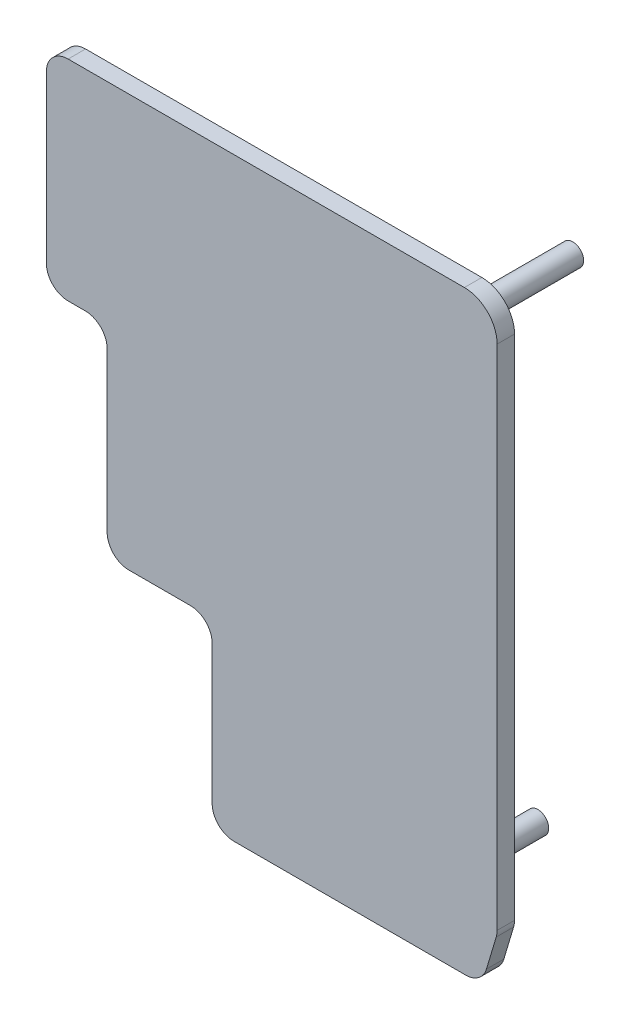
ISO-10303-21;
HEADER;
FILE_DESCRIPTION(('STEP AP214'),'2;1');
FILE_NAME('part.step','',(''),(''),'','','');
FILE_SCHEMA(('AUTOMOTIVE_DESIGN { 1 0 10303 214 1 1 1 1 }'));
ENDSEC;
DATA;
#1=APPLICATION_CONTEXT('core data for automotive mechanical design processes');
#2=APPLICATION_PROTOCOL_DEFINITION('international standard','automotive_design',2000,#1);
#3=PRODUCT_CONTEXT('',#1,'mechanical');
#4=PRODUCT('Part','Part','',(#3));
#5=PRODUCT_RELATED_PRODUCT_CATEGORY('part','',(#4));
#6=PRODUCT_DEFINITION_FORMATION('','',#4);
#7=PRODUCT_DEFINITION_CONTEXT('part definition',#1,'design');
#8=PRODUCT_DEFINITION('design','',#6,#7);
#9=PRODUCT_DEFINITION_SHAPE('','',#8);
#10=(LENGTH_UNIT() NAMED_UNIT(*) SI_UNIT(.MILLI.,.METRE.));
#11=(NAMED_UNIT(*) PLANE_ANGLE_UNIT() SI_UNIT($,.RADIAN.));
#12=(NAMED_UNIT(*) SI_UNIT($,.STERADIAN.) SOLID_ANGLE_UNIT());
#13=UNCERTAINTY_MEASURE_WITH_UNIT(LENGTH_MEASURE(1.E-05),#10,'distance_accuracy_value','');
#14=(GEOMETRIC_REPRESENTATION_CONTEXT(3) GLOBAL_UNCERTAINTY_ASSIGNED_CONTEXT((#13)) GLOBAL_UNIT_ASSIGNED_CONTEXT((#10,
#11,#12)) REPRESENTATION_CONTEXT('',''));
#15=CARTESIAN_POINT('',(0.,0.,0.));
#16=DIRECTION('',(0.,0.,1.));
#17=DIRECTION('',(1.,0.,0.));
#18=AXIS2_PLACEMENT_3D('',#15,#16,#17);
#19=CARTESIAN_POINT('',(68.6324839489616,0.,1.6));
#20=DIRECTION('',(-1.,0.,0.));
#21=DIRECTION('',(0.,0.,1.));
#22=AXIS2_PLACEMENT_3D('',#19,#20,#21);
#23=PLANE('',#22);
#24=DIRECTION('',(0.,1.,0.));
#25=VECTOR('',#24,1.);
#26=CARTESIAN_POINT('',(68.6324839489616,0.,1.6));
#27=LINE('',#26,#25);
#28=CARTESIAN_POINT('',(68.6324839489616,-8.00277031801415,1.6));
#29=VERTEX_POINT('',#28);
#30=CARTESIAN_POINT('',(68.6324839489616,38.6160205881941,1.6));
#31=VERTEX_POINT('',#30);
#32=EDGE_CURVE('E171',#29,#31,#27,.T.);
#33=ORIENTED_EDGE('',*,*,#32,.F.);
#34=DIRECTION('',(0.,0.,-1.));
#35=VECTOR('',#34,1.);
#36=CARTESIAN_POINT('',(68.6324839489616,-8.00277031801415,1.6));
#37=LINE('',#36,#35);
#38=CARTESIAN_POINT('',(68.6324839489616,-8.00277031801415,0.));
#39=VERTEX_POINT('',#38);
#40=EDGE_CURVE('E251',#29,#39,#37,.T.);
#41=ORIENTED_EDGE('',*,*,#40,.T.);
#42=DIRECTION('',(0.,1.,0.));
#43=VECTOR('',#42,1.);
#44=CARTESIAN_POINT('',(68.6324839489616,0.,0.));
#45=LINE('',#44,#43);
#46=CARTESIAN_POINT('',(68.6324839489616,38.6160205881941,0.));
#47=VERTEX_POINT('',#46);
#48=EDGE_CURVE('E198',#39,#47,#45,.T.);
#49=ORIENTED_EDGE('',*,*,#48,.T.);
#50=DIRECTION('',(0.,0.,-1.));
#51=VECTOR('',#50,1.);
#52=CARTESIAN_POINT('',(68.6324839489616,38.6160205881941,1.6));
#53=LINE('',#52,#51);
#54=EDGE_CURVE('E191',#31,#47,#53,.T.);
#55=ORIENTED_EDGE('',*,*,#54,.F.);
#56=EDGE_LOOP('',(#33,#41,#49,#55));
#57=FACE_BOUND('',#56,.T.);
#58=ADVANCED_FACE('F45',(#57),#23,.F.);
#59=CARTESIAN_POINT('',(65.6324839209757,38.6160205881941,1.6));
#60=DIRECTION('',(0.,0.,-1.));
#61=DIRECTION('',(-1.,0.,0.));
#62=AXIS2_PLACEMENT_3D('',#59,#60,#61);
#63=CYLINDRICAL_SURFACE('',#62,3.00000002798594);
#64=CARTESIAN_POINT('',(65.6324839209757,38.6160205881941,0.));
#65=DIRECTION('',(0.,0.,1.));
#66=DIRECTION('',(1.,0.,0.));
#67=AXIS2_PLACEMENT_3D('',#64,#65,#66);
#68=CIRCLE('',#67,3.00000002798594);
#69=CARTESIAN_POINT('',(65.6305603396611,41.6160199994858,0.));
#70=VERTEX_POINT('',#69);
#71=EDGE_CURVE('E358',#47,#70,#68,.T.);
#72=ORIENTED_EDGE('',*,*,#71,.T.);
#73=DIRECTION('',(0.,0.,-1.));
#74=VECTOR('',#73,1.);
#75=CARTESIAN_POINT('',(65.6305603396611,41.6160199994858,1.6));
#76=LINE('',#75,#74);
#77=CARTESIAN_POINT('',(65.6305603396611,41.6160199994858,1.6));
#78=VERTEX_POINT('',#77);
#79=EDGE_CURVE('E193',#78,#70,#76,.T.);
#80=ORIENTED_EDGE('',*,*,#79,.F.);
#81=CARTESIAN_POINT('',(65.6324839209757,38.6160205881941,1.6));
#82=DIRECTION('',(0.,0.,1.));
#83=DIRECTION('',(1.,0.,0.));
#84=AXIS2_PLACEMENT_3D('',#81,#82,#83);
#85=CIRCLE('',#84,3.00000002798594);
#86=EDGE_CURVE('E176',#31,#78,#85,.T.);
#87=ORIENTED_EDGE('',*,*,#86,.F.);
#88=ORIENTED_EDGE('',*,*,#54,.T.);
#89=EDGE_LOOP('',(#72,#80,#87,#88));
#90=FACE_BOUND('',#89,.T.);
#91=ADVANCED_FACE('F190',(#90),#63,.T.);
#92=CARTESIAN_POINT('',(-0.0266585019055289,41.5739185292487,1.6));
#93=DIRECTION('',(-0.000641231266330706,0.99999979441121,0.));
#94=DIRECTION('',(-0.999999794411211,-0.000641231266330706,0.));
#95=AXIS2_PLACEMENT_3D('',#92,#93,#94);
#96=PLANE('',#95);
#97=DIRECTION('',(0.99999979441121,0.000641231266330706,0.));
#98=VECTOR('',#97,1.);
#99=CARTESIAN_POINT('',(-0.0266585019055289,41.5739185292487,0.));
#100=LINE('',#99,#98);
#101=CARTESIAN_POINT('',(29.2444781737514,41.592688101145,0.));
#102=VERTEX_POINT('',#101);
#103=EDGE_CURVE('E362',#102,#70,#100,.T.);
#104=ORIENTED_EDGE('',*,*,#103,.F.);
#105=DIRECTION('',(0.,0.,-1.));
#106=VECTOR('',#105,1.);
#107=CARTESIAN_POINT('',(29.2444781737514,41.592688101145,1.6));
#108=LINE('',#107,#106);
#109=CARTESIAN_POINT('',(29.2444781737514,41.592688101145,1.6));
#110=VERTEX_POINT('',#109);
#111=EDGE_CURVE('E308',#102,#110,#108,.F.);
#112=ORIENTED_EDGE('',*,*,#111,.T.);
#113=DIRECTION('',(0.99999979441121,0.000641231266330706,0.));
#114=VECTOR('',#113,1.);
#115=CARTESIAN_POINT('',(-0.0266585019055289,41.5739185292487,1.6));
#116=LINE('',#115,#114);
#117=EDGE_CURVE('E195',#110,#78,#116,.T.);
#118=ORIENTED_EDGE('',*,*,#117,.T.);
#119=ORIENTED_EDGE('',*,*,#79,.T.);
#120=EDGE_LOOP('',(#104,#112,#118,#119));
#121=FACE_BOUND('',#120,.T.);
#122=ADVANCED_FACE('F394',(#121),#96,.T.);
#123=CARTESIAN_POINT('',(27.245760636284,0.,1.6));
#124=DIRECTION('',(1.,0.,0.));
#125=DIRECTION('',(0.,0.,-1.));
#126=AXIS2_PLACEMENT_3D('',#123,#124,#125);
#127=PLANE('',#126);
#128=DIRECTION('',(0.,-1.,0.));
#129=VECTOR('',#128,1.);
#130=CARTESIAN_POINT('',(27.245760636284,0.,1.6));
#131=LINE('',#130,#129);
#132=CARTESIAN_POINT('',(27.245760636284,39.5926885123226,1.6));
#133=VERTEX_POINT('',#132);
#134=CARTESIAN_POINT('',(27.245760636284,24.3514116181502,1.6));
#135=VERTEX_POINT('',#134);
#136=EDGE_CURVE('E397',#133,#135,#131,.T.);
#137=ORIENTED_EDGE('',*,*,#136,.F.);
#138=DIRECTION('',(0.,0.,-1.));
#139=VECTOR('',#138,1.);
#140=CARTESIAN_POINT('',(27.245760636284,39.5926885123226,0.));
#141=LINE('',#140,#139);
#142=CARTESIAN_POINT('',(27.245760636284,39.5926885123226,0.));
#143=VERTEX_POINT('',#142);
#144=EDGE_CURVE('E304',#133,#143,#141,.T.);
#145=ORIENTED_EDGE('',*,*,#144,.T.);
#146=DIRECTION('',(0.,-1.,0.));
#147=VECTOR('',#146,1.);
#148=CARTESIAN_POINT('',(27.245760636284,0.,0.));
#149=LINE('',#148,#147);
#150=CARTESIAN_POINT('',(27.245760636284,24.3514116181502,0.));
#151=VERTEX_POINT('',#150);
#152=EDGE_CURVE('E365',#143,#151,#149,.T.);
#153=ORIENTED_EDGE('',*,*,#152,.T.);
#154=DIRECTION('',(0.,0.,-1.));
#155=VECTOR('',#154,1.);
#156=CARTESIAN_POINT('',(27.245760636284,24.3514116181502,1.6));
#157=LINE('',#156,#155);
#158=EDGE_CURVE('E301',#151,#135,#157,.F.);
#159=ORIENTED_EDGE('',*,*,#158,.T.);
#160=EDGE_LOOP('',(#137,#145,#153,#159));
#161=FACE_BOUND('',#160,.T.);
#162=ADVANCED_FACE('F431',(#161),#127,.F.);
#163=CARTESIAN_POINT('',(0.,22.3514116181502,1.6));
#164=DIRECTION('',(0.,1.,0.));
#165=DIRECTION('',(0.,0.,1.));
#166=AXIS2_PLACEMENT_3D('',#163,#164,#165);
#167=PLANE('',#166);
#168=DIRECTION('',(1.,0.,0.));
#169=VECTOR('',#168,1.);
#170=CARTESIAN_POINT('',(0.,22.3514116181502,0.));
#171=LINE('',#170,#169);
#172=CARTESIAN_POINT('',(29.2457606362841,22.3514116181502,0.));
#173=VERTEX_POINT('',#172);
#174=CARTESIAN_POINT('',(30.8273266889358,22.3514116181502,0.));
#175=VERTEX_POINT('',#174);
#176=EDGE_CURVE('E369',#173,#175,#171,.T.);
#177=ORIENTED_EDGE('',*,*,#176,.T.);
#178=DIRECTION('',(0.,0.,-1.));
#179=VECTOR('',#178,1.);
#180=CARTESIAN_POINT('',(30.8273266889358,22.3514116181502,1.6));
#181=LINE('',#180,#179);
#182=CARTESIAN_POINT('',(30.8273266889358,22.3514116181502,1.6));
#183=VERTEX_POINT('',#182);
#184=EDGE_CURVE('E234',#175,#183,#181,.F.);
#185=ORIENTED_EDGE('',*,*,#184,.T.);
#186=DIRECTION('',(1.,0.,0.));
#187=VECTOR('',#186,1.);
#188=CARTESIAN_POINT('',(0.,22.3514116181502,1.6));
#189=LINE('',#188,#187);
#190=CARTESIAN_POINT('',(29.2457606362841,22.3514116181502,1.6));
#191=VERTEX_POINT('',#190);
#192=EDGE_CURVE('E401',#191,#183,#189,.T.);
#193=ORIENTED_EDGE('',*,*,#192,.F.);
#194=DIRECTION('',(0.,0.,-1.));
#195=VECTOR('',#194,1.);
#196=CARTESIAN_POINT('',(29.2457606362841,22.3514116181502,1.6));
#197=LINE('',#196,#195);
#198=EDGE_CURVE('E230',#191,#173,#197,.T.);
#199=ORIENTED_EDGE('',*,*,#198,.T.);
#200=EDGE_LOOP('',(#177,#185,#193,#199));
#201=FACE_BOUND('',#200,.T.);
#202=ADVANCED_FACE('F423',(#201),#167,.F.);
#203=CARTESIAN_POINT('',(32.8273266889358,0.,1.6));
#204=DIRECTION('',(1.,0.,0.));
#205=DIRECTION('',(0.,0.,-1.));
#206=AXIS2_PLACEMENT_3D('',#203,#204,#205);
#207=PLANE('',#206);
#208=DIRECTION('',(0.,-1.,0.));
#209=VECTOR('',#208,1.);
#210=CARTESIAN_POINT('',(32.8273266889358,0.,1.6));
#211=LINE('',#210,#209);
#212=CARTESIAN_POINT('',(32.8273266889358,20.3514116181502,1.6));
#213=VERTEX_POINT('',#212);
#214=CARTESIAN_POINT('',(32.8273266889358,5.74537726234352,1.6));
#215=VERTEX_POINT('',#214);
#216=EDGE_CURVE('E350',#213,#215,#211,.T.);
#217=ORIENTED_EDGE('',*,*,#216,.F.);
#218=DIRECTION('',(0.,0.,-1.));
#219=VECTOR('',#218,1.);
#220=CARTESIAN_POINT('',(32.8273266889358,20.3514116181502,0.));
#221=LINE('',#220,#219);
#222=CARTESIAN_POINT('',(32.8273266889358,20.3514116181502,0.));
#223=VERTEX_POINT('',#222);
#224=EDGE_CURVE('E226',#213,#223,#221,.T.);
#225=ORIENTED_EDGE('',*,*,#224,.T.);
#226=DIRECTION('',(0.,-1.,0.));
#227=VECTOR('',#226,1.);
#228=CARTESIAN_POINT('',(32.8273266889358,0.,0.));
#229=LINE('',#228,#227);
#230=CARTESIAN_POINT('',(32.8273266889358,5.74537726234352,0.));
#231=VERTEX_POINT('',#230);
#232=EDGE_CURVE('E334',#223,#231,#229,.T.);
#233=ORIENTED_EDGE('',*,*,#232,.T.);
#234=DIRECTION('',(0.,0.,-1.));
#235=VECTOR('',#234,1.);
#236=CARTESIAN_POINT('',(32.8273266889358,5.74537726234352,1.6));
#237=LINE('',#236,#235);
#238=EDGE_CURVE('E223',#231,#215,#237,.F.);
#239=ORIENTED_EDGE('',*,*,#238,.T.);
#240=EDGE_LOOP('',(#217,#225,#233,#239));
#241=FACE_BOUND('',#240,.T.);
#242=ADVANCED_FACE('F417',(#241),#207,.F.);
#243=CARTESIAN_POINT('',(0.,3.74537726234352,1.6));
#244=DIRECTION('',(0.,1.,0.));
#245=DIRECTION('',(0.,0.,1.));
#246=AXIS2_PLACEMENT_3D('',#243,#244,#245);
#247=PLANE('',#246);
#248=DIRECTION('',(1.,0.,0.));
#249=VECTOR('',#248,1.);
#250=CARTESIAN_POINT('',(0.,3.74537726234352,0.));
#251=LINE('',#250,#249);
#252=CARTESIAN_POINT('',(34.8273266889358,3.74537726234352,0.));
#253=VERTEX_POINT('',#252);
#254=CARTESIAN_POINT('',(40.4686354005811,3.74537726234352,0.));
#255=VERTEX_POINT('',#254);
#256=EDGE_CURVE('E322',#253,#255,#251,.T.);
#257=ORIENTED_EDGE('',*,*,#256,.T.);
#258=DIRECTION('',(0.,0.,-1.));
#259=VECTOR('',#258,1.);
#260=CARTESIAN_POINT('',(40.4686354005811,3.74537726234352,1.6));
#261=LINE('',#260,#259);
#262=CARTESIAN_POINT('',(40.4686354005811,3.74537726234352,1.6));
#263=VERTEX_POINT('',#262);
#264=EDGE_CURVE('E248',#255,#263,#261,.F.);
#265=ORIENTED_EDGE('',*,*,#264,.T.);
#266=DIRECTION('',(1.,0.,0.));
#267=VECTOR('',#266,1.);
#268=CARTESIAN_POINT('',(0.,3.74537726234352,1.6));
#269=LINE('',#268,#267);
#270=CARTESIAN_POINT('',(34.8273266889358,3.74537726234352,1.6));
#271=VERTEX_POINT('',#270);
#272=EDGE_CURVE('E340',#271,#263,#269,.T.);
#273=ORIENTED_EDGE('',*,*,#272,.F.);
#274=DIRECTION('',(0.,0.,-1.));
#275=VECTOR('',#274,1.);
#276=CARTESIAN_POINT('',(34.8273266889358,3.74537726234352,1.6));
#277=LINE('',#276,#275);
#278=EDGE_CURVE('E244',#271,#253,#277,.T.);
#279=ORIENTED_EDGE('',*,*,#278,.T.);
#280=EDGE_LOOP('',(#257,#265,#273,#279));
#281=FACE_BOUND('',#280,.T.);
#282=ADVANCED_FACE('F329',(#281),#247,.F.);
#283=CARTESIAN_POINT('',(42.4686354005811,0.,1.6));
#284=DIRECTION('',(1.,0.,0.));
#285=DIRECTION('',(0.,0.,-1.));
#286=AXIS2_PLACEMENT_3D('',#283,#284,#285);
#287=PLANE('',#286);
#288=DIRECTION('',(0.,-1.,0.));
#289=VECTOR('',#288,1.);
#290=CARTESIAN_POINT('',(42.4686354005811,0.,1.6));
#291=LINE('',#290,#289);
#292=CARTESIAN_POINT('',(42.4686354005811,1.74537726234352,1.6));
#293=VERTEX_POINT('',#292);
#294=CARTESIAN_POINT('',(42.4686354005811,-11.0000536578825,1.6));
#295=VERTEX_POINT('',#294);
#296=EDGE_CURVE('E339',#293,#295,#291,.T.);
#297=ORIENTED_EDGE('',*,*,#296,.F.);
#298=DIRECTION('',(0.,0.,-1.));
#299=VECTOR('',#298,1.);
#300=CARTESIAN_POINT('',(42.4686354005811,1.74537726234352,0.));
#301=LINE('',#300,#299);
#302=CARTESIAN_POINT('',(42.4686354005811,1.74537726234352,0.));
#303=VERTEX_POINT('',#302);
#304=EDGE_CURVE('E240',#293,#303,#301,.T.);
#305=ORIENTED_EDGE('',*,*,#304,.T.);
#306=DIRECTION('',(0.,-1.,0.));
#307=VECTOR('',#306,1.);
#308=CARTESIAN_POINT('',(42.4686354005811,0.,0.));
#309=LINE('',#308,#307);
#310=CARTESIAN_POINT('',(42.4686354005811,-11.0000536578825,0.));
#311=VERTEX_POINT('',#310);
#312=EDGE_CURVE('E324',#303,#311,#309,.T.);
#313=ORIENTED_EDGE('',*,*,#312,.T.);
#314=DIRECTION('',(0.,0.,-1.));
#315=VECTOR('',#314,1.);
#316=CARTESIAN_POINT('',(42.4686354005811,-11.0000536578825,1.6));
#317=LINE('',#316,#315);
#318=EDGE_CURVE('E237',#311,#295,#317,.F.);
#319=ORIENTED_EDGE('',*,*,#318,.T.);
#320=EDGE_LOOP('',(#297,#305,#313,#319));
#321=FACE_BOUND('',#320,.T.);
#322=ADVANCED_FACE('F342',(#321),#287,.F.);
#323=CARTESIAN_POINT('',(0.,-13.0000536578825,1.6));
#324=DIRECTION('',(0.,1.,0.));
#325=DIRECTION('',(-1.,0.,0.));
#326=AXIS2_PLACEMENT_3D('',#323,#324,#325);
#327=PLANE('',#326);
#328=DIRECTION('',(1.,0.,0.));
#329=VECTOR('',#328,1.);
#330=CARTESIAN_POINT('',(0.,-13.0000536578825,0.));
#331=LINE('',#330,#329);
#332=CARTESIAN_POINT('',(44.4686354005811,-13.0000536578825,0.));
#333=VERTEX_POINT('',#332);
#334=CARTESIAN_POINT('',(65.7367709119832,-13.0000536578825,0.));
#335=VERTEX_POINT('',#334);
#336=EDGE_CURVE('E378',#333,#335,#331,.T.);
#337=ORIENTED_EDGE('',*,*,#336,.T.);
#338=DIRECTION('',(0.,0.,-1.));
#339=VECTOR('',#338,1.);
#340=CARTESIAN_POINT('',(65.7367709119832,-13.0000536578825,1.6));
#341=LINE('',#340,#339);
#342=CARTESIAN_POINT('',(65.7367709119832,-13.0000536578825,1.6));
#343=VERTEX_POINT('',#342);
#344=EDGE_CURVE('E61',#335,#343,#341,.F.);
#345=ORIENTED_EDGE('',*,*,#344,.T.);
#346=DIRECTION('',(1.,0.,0.));
#347=VECTOR('',#346,1.);
#348=CARTESIAN_POINT('',(0.,-13.0000536578825,1.6));
#349=LINE('',#348,#347);
#350=CARTESIAN_POINT('',(44.4686354005811,-13.0000536578825,1.6));
#351=VERTEX_POINT('',#350);
#352=EDGE_CURVE('E345',#351,#343,#349,.T.);
#353=ORIENTED_EDGE('',*,*,#352,.F.);
#354=DIRECTION('',(0.,0.,-1.));
#355=VECTOR('',#354,1.);
#356=CARTESIAN_POINT('',(44.4686354005811,-13.0000536578825,1.6));
#357=LINE('',#356,#355);
#358=EDGE_CURVE('E295',#351,#333,#357,.T.);
#359=ORIENTED_EDGE('',*,*,#358,.T.);
#360=EDGE_LOOP('',(#337,#345,#353,#359));
#361=FACE_BOUND('',#360,.T.);
#362=ADVANCED_FACE('F600',(#361),#327,.F.);
#363=CARTESIAN_POINT('',(65.2814000721246,-19.5087999652971,1.6));
#364=DIRECTION('',(-0.958131213096644,0.286329492874823,0.));
#365=DIRECTION('',(-0.286329492874823,-0.958131213096644,0.));
#366=AXIS2_PLACEMENT_3D('',#363,#364,#365);
#367=PLANE('',#366);
#368=DIRECTION('',(0.286329492874823,0.958131213096644,0.));
#369=VECTOR('',#368,1.);
#370=CARTESIAN_POINT('',(65.2814000721246,-19.5087999652971,0.));
#371=LINE('',#370,#369);
#372=CARTESIAN_POINT('',(67.6530333381765,-11.5727126436321,0.));
#373=VERTEX_POINT('',#372);
#374=CARTESIAN_POINT('',(68.5487463751549,-8.5754293037638,0.));
#375=VERTEX_POINT('',#374);
#376=EDGE_CURVE('E185',#373,#375,#371,.T.);
#377=ORIENTED_EDGE('',*,*,#376,.T.);
#378=DIRECTION('',(0.,0.,-1.));
#379=VECTOR('',#378,1.);
#380=CARTESIAN_POINT('',(68.5487463751549,-8.5754293037638,1.6));
#381=LINE('',#380,#379);
#382=CARTESIAN_POINT('',(68.5487463751549,-8.5754293037638,1.6));
#383=VERTEX_POINT('',#382);
#384=EDGE_CURVE('E276',#375,#383,#381,.F.);
#385=ORIENTED_EDGE('',*,*,#384,.T.);
#386=DIRECTION('',(0.286329492874823,0.958131213096644,0.));
#387=VECTOR('',#386,1.);
#388=CARTESIAN_POINT('',(65.2814000721246,-19.5087999652971,1.6));
#389=LINE('',#388,#387);
#390=CARTESIAN_POINT('',(67.6530333381765,-11.5727126436321,1.6));
#391=VERTEX_POINT('',#390);
#392=EDGE_CURVE('E208',#391,#383,#389,.T.);
#393=ORIENTED_EDGE('',*,*,#392,.F.);
#394=DIRECTION('',(0.,0.,-1.));
#395=VECTOR('',#394,1.);
#396=CARTESIAN_POINT('',(67.6530333381765,-11.5727126436321,1.6));
#397=LINE('',#396,#395);
#398=EDGE_CURVE('E272',#391,#373,#397,.T.);
#399=ORIENTED_EDGE('',*,*,#398,.T.);
#400=EDGE_LOOP('',(#377,#385,#393,#399));
#401=FACE_BOUND('',#400,.T.);
#402=ADVANCED_FACE('F385',(#401),#367,.F.);
#403=CARTESIAN_POINT('',(0.,0.,1.6));
#404=DIRECTION('',(0.,0.,1.));
#405=DIRECTION('',(1.,0.,0.));
#406=AXIS2_PLACEMENT_3D('',#403,#404,#405);
#407=PLANE('',#406);
#408=ORIENTED_EDGE('',*,*,#392,.T.);
#409=CARTESIAN_POINT('',(66.6324839489616,-8.00277031801415,1.6));
#410=DIRECTION('',(0.,0.,1.));
#411=DIRECTION('',(1.,0.,0.));
#412=AXIS2_PLACEMENT_3D('',#409,#410,#411);
#413=CIRCLE('',#412,2.);
#414=EDGE_CURVE('E179',#383,#29,#413,.T.);
#415=ORIENTED_EDGE('',*,*,#414,.T.);
#416=ORIENTED_EDGE('',*,*,#32,.T.);
#417=ORIENTED_EDGE('',*,*,#86,.T.);
#418=ORIENTED_EDGE('',*,*,#117,.F.);
#419=CARTESIAN_POINT('',(29.2457606362841,39.5926885123226,1.6));
#420=DIRECTION('',(0.,0.,1.));
#421=DIRECTION('',(1.,0.,0.));
#422=AXIS2_PLACEMENT_3D('',#419,#420,#421);
#423=CIRCLE('',#422,2.);
#424=EDGE_CURVE('E287',#110,#133,#423,.T.);
#425=ORIENTED_EDGE('',*,*,#424,.T.);
#426=ORIENTED_EDGE('',*,*,#136,.T.);
#427=CARTESIAN_POINT('',(29.2457606362841,24.3514116181502,1.6));
#428=DIRECTION('',(0.,0.,1.));
#429=DIRECTION('',(1.,0.,0.));
#430=AXIS2_PLACEMENT_3D('',#427,#428,#429);
#431=CIRCLE('',#430,2.);
#432=EDGE_CURVE('E279',#135,#191,#431,.T.);
#433=ORIENTED_EDGE('',*,*,#432,.T.);
#434=ORIENTED_EDGE('',*,*,#192,.T.);
#435=CARTESIAN_POINT('',(30.8273266889358,20.3514116181502,1.6));
#436=DIRECTION('',(0.,0.,1.));
#437=DIRECTION('',(1.,0.,0.));
#438=AXIS2_PLACEMENT_3D('',#435,#436,#437);
#439=CIRCLE('',#438,2.);
#440=EDGE_CURVE('E314',#183,#213,#439,.F.);
#441=ORIENTED_EDGE('',*,*,#440,.T.);
#442=ORIENTED_EDGE('',*,*,#216,.T.);
#443=CARTESIAN_POINT('',(34.8273266889358,5.74537726234352,1.6));
#444=DIRECTION('',(0.,0.,1.));
#445=DIRECTION('',(1.,0.,0.));
#446=AXIS2_PLACEMENT_3D('',#443,#444,#445);
#447=CIRCLE('',#446,2.);
#448=EDGE_CURVE('E282',#215,#271,#447,.T.);
#449=ORIENTED_EDGE('',*,*,#448,.T.);
#450=ORIENTED_EDGE('',*,*,#272,.T.);
#451=CARTESIAN_POINT('',(40.4686354005811,1.74537726234352,1.6));
#452=DIRECTION('',(0.,0.,1.));
#453=DIRECTION('',(1.,0.,0.));
#454=AXIS2_PLACEMENT_3D('',#451,#452,#453);
#455=CIRCLE('',#454,2.);
#456=EDGE_CURVE('E11',#263,#293,#455,.F.);
#457=ORIENTED_EDGE('',*,*,#456,.T.);
#458=ORIENTED_EDGE('',*,*,#296,.T.);
#459=CARTESIAN_POINT('',(44.4686354005811,-11.0000536578825,1.6));
#460=DIRECTION('',(0.,0.,1.));
#461=DIRECTION('',(1.,0.,0.));
#462=AXIS2_PLACEMENT_3D('',#459,#460,#461);
#463=CIRCLE('',#462,2.);
#464=EDGE_CURVE('E68',#295,#351,#463,.T.);
#465=ORIENTED_EDGE('',*,*,#464,.T.);
#466=ORIENTED_EDGE('',*,*,#352,.T.);
#467=CARTESIAN_POINT('',(65.7367709119832,-11.0000536578825,1.6));
#468=DIRECTION('',(0.,0.,1.));
#469=DIRECTION('',(1.,0.,0.));
#470=AXIS2_PLACEMENT_3D('',#467,#468,#469);
#471=CIRCLE('',#470,2.);
#472=EDGE_CURVE('E290',#343,#391,#471,.T.);
#473=ORIENTED_EDGE('',*,*,#472,.T.);
#474=EDGE_LOOP('',(#408,#415,#416,#417,#418,#425,#426,#433,#434,#441,#442,#449,#450,#457,#458,
#465,#466,#473));
#475=FACE_BOUND('',#474,.T.);
#476=ADVANCED_FACE('F174',(#475),#407,.T.);
#477=CARTESIAN_POINT('',(0.,0.,0.));
#478=DIRECTION('',(0.,0.,1.));
#479=DIRECTION('',(1.,0.,0.));
#480=AXIS2_PLACEMENT_3D('',#477,#478,#479);
#481=PLANE('',#480);
#482=CARTESIAN_POINT('',(30.536864631926,26.32209441645,0.));
#483=DIRECTION('',(0.,0.,1.));
#484=DIRECTION('',(1.,0.,0.));
#485=AXIS2_PLACEMENT_3D('',#482,#483,#484);
#486=CIRCLE('',#485,1.);
#487=CARTESIAN_POINT('',(31.536864631926,26.32209441645,0.));
#488=VERTEX_POINT('',#487);
#489=EDGE_CURVE('E219',#488,#488,#486,.F.);
#490=ORIENTED_EDGE('',*,*,#489,.F.);
#491=EDGE_LOOP('',(#490));
#492=FACE_BOUND('',#491,.T.);
#493=CARTESIAN_POINT('',(45.8275512794002,-10.7396175052852,0.));
#494=DIRECTION('',(0.,0.,1.));
#495=DIRECTION('',(1.,0.,0.));
#496=AXIS2_PLACEMENT_3D('',#493,#494,#495);
#497=CIRCLE('',#496,0.999999999999998);
#498=CARTESIAN_POINT('',(46.8275512794002,-10.7396175052852,0.));
#499=VERTEX_POINT('',#498);
#500=EDGE_CURVE('E215',#499,#499,#497,.F.);
#501=ORIENTED_EDGE('',*,*,#500,.F.);
#502=EDGE_LOOP('',(#501));
#503=FACE_BOUND('',#502,.T.);
#504=CARTESIAN_POINT('',(61.7735530689091,-8.11835693714676,0.));
#505=DIRECTION('',(0.,0.,1.));
#506=DIRECTION('',(1.,0.,0.));
#507=AXIS2_PLACEMENT_3D('',#504,#505,#506);
#508=CIRCLE('',#507,0.999999999999998);
#509=CARTESIAN_POINT('',(62.7735530689091,-8.11835693714676,0.));
#510=VERTEX_POINT('',#509);
#511=EDGE_CURVE('E206',#510,#510,#508,.F.);
#512=ORIENTED_EDGE('',*,*,#511,.F.);
#513=EDGE_LOOP('',(#512));
#514=FACE_BOUND('',#513,.T.);
#515=CARTESIAN_POINT('',(64.9773159855227,38.6274565279888,0.));
#516=DIRECTION('',(0.,0.,1.));
#517=DIRECTION('',(1.,0.,0.));
#518=AXIS2_PLACEMENT_3D('',#515,#516,#517);
#519=CIRCLE('',#518,0.999999999999998);
#520=CARTESIAN_POINT('',(65.9773159855227,38.6274565279888,0.));
#521=VERTEX_POINT('',#520);
#522=EDGE_CURVE('E201',#521,#521,#519,.F.);
#523=ORIENTED_EDGE('',*,*,#522,.F.);
#524=EDGE_LOOP('',(#523));
#525=FACE_BOUND('',#524,.T.);
#526=ORIENTED_EDGE('',*,*,#48,.F.);
#527=CARTESIAN_POINT('',(66.6324839489616,-8.00277031801415,0.));
#528=DIRECTION('',(0.,0.,1.));
#529=DIRECTION('',(1.,0.,0.));
#530=AXIS2_PLACEMENT_3D('',#527,#528,#529);
#531=CIRCLE('',#530,2.);
#532=EDGE_CURVE('E269',#39,#375,#531,.F.);
#533=ORIENTED_EDGE('',*,*,#532,.T.);
#534=ORIENTED_EDGE('',*,*,#376,.F.);
#535=CARTESIAN_POINT('',(65.7367709119832,-11.0000536578825,0.));
#536=DIRECTION('',(0.,0.,1.));
#537=DIRECTION('',(1.,0.,0.));
#538=AXIS2_PLACEMENT_3D('',#535,#536,#537);
#539=CIRCLE('',#538,2.);
#540=EDGE_CURVE('E266',#373,#335,#539,.F.);
#541=ORIENTED_EDGE('',*,*,#540,.T.);
#542=ORIENTED_EDGE('',*,*,#336,.F.);
#543=CARTESIAN_POINT('',(44.4686354005811,-11.0000536578825,0.));
#544=DIRECTION('',(0.,0.,1.));
#545=DIRECTION('',(1.,0.,0.));
#546=AXIS2_PLACEMENT_3D('',#543,#544,#545);
#547=CIRCLE('',#546,2.);
#548=EDGE_CURVE('E260',#333,#311,#547,.F.);
#549=ORIENTED_EDGE('',*,*,#548,.T.);
#550=ORIENTED_EDGE('',*,*,#312,.F.);
#551=CARTESIAN_POINT('',(40.4686354005811,1.74537726234352,0.));
#552=DIRECTION('',(0.,0.,1.));
#553=DIRECTION('',(1.,0.,0.));
#554=AXIS2_PLACEMENT_3D('',#551,#552,#553);
#555=CIRCLE('',#554,2.);
#556=EDGE_CURVE('E54',#303,#255,#555,.T.);
#557=ORIENTED_EDGE('',*,*,#556,.T.);
#558=ORIENTED_EDGE('',*,*,#256,.F.);
#559=CARTESIAN_POINT('',(34.8273266889358,5.74537726234352,0.));
#560=DIRECTION('',(0.,0.,1.));
#561=DIRECTION('',(1.,0.,0.));
#562=AXIS2_PLACEMENT_3D('',#559,#560,#561);
#563=CIRCLE('',#562,2.);
#564=EDGE_CURVE('E257',#253,#231,#563,.F.);
#565=ORIENTED_EDGE('',*,*,#564,.T.);
#566=ORIENTED_EDGE('',*,*,#232,.F.);
#567=CARTESIAN_POINT('',(30.8273266889358,20.3514116181502,0.));
#568=DIRECTION('',(0.,0.,1.));
#569=DIRECTION('',(1.,0.,0.));
#570=AXIS2_PLACEMENT_3D('',#567,#568,#569);
#571=CIRCLE('',#570,2.);
#572=EDGE_CURVE('E311',#223,#175,#571,.T.);
#573=ORIENTED_EDGE('',*,*,#572,.T.);
#574=ORIENTED_EDGE('',*,*,#176,.F.);
#575=CARTESIAN_POINT('',(29.2457606362841,24.3514116181502,0.));
#576=DIRECTION('',(0.,0.,1.));
#577=DIRECTION('',(1.,0.,0.));
#578=AXIS2_PLACEMENT_3D('',#575,#576,#577);
#579=CIRCLE('',#578,2.);
#580=EDGE_CURVE('E254',#173,#151,#579,.F.);
#581=ORIENTED_EDGE('',*,*,#580,.T.);
#582=ORIENTED_EDGE('',*,*,#152,.F.);
#583=CARTESIAN_POINT('',(29.2457606362841,39.5926885123226,0.));
#584=DIRECTION('',(0.,0.,1.));
#585=DIRECTION('',(1.,0.,0.));
#586=AXIS2_PLACEMENT_3D('',#583,#584,#585);
#587=CIRCLE('',#586,2.);
#588=EDGE_CURVE('E263',#143,#102,#587,.F.);
#589=ORIENTED_EDGE('',*,*,#588,.T.);
#590=ORIENTED_EDGE('',*,*,#103,.T.);
#591=ORIENTED_EDGE('',*,*,#71,.F.);
#592=EDGE_LOOP('',(#526,#533,#534,#541,#542,#549,#550,#557,#558,#565,#566,#573,#574,#581,#582,
#589,#590,#591));
#593=FACE_BOUND('',#592,.T.);
#594=ADVANCED_FACE('F321',(#492,#503,#514,#525,#593),#481,.F.);
#595=CARTESIAN_POINT('',(64.9773159855227,38.6274565279888,-9.));
#596=DIRECTION('',(0.,0.,1.));
#597=DIRECTION('',(1.,0.,0.));
#598=AXIS2_PLACEMENT_3D('',#595,#596,#597);
#599=CYLINDRICAL_SURFACE('',#598,0.999999999999998);
#600=CARTESIAN_POINT('',(64.9773159855227,38.6274565279888,-9.));
#601=DIRECTION('',(0.,0.,-1.));
#602=DIRECTION('',(-1.,0.,0.));
#603=AXIS2_PLACEMENT_3D('',#600,#601,#602);
#604=CIRCLE('',#603,0.999999999999998);
#605=CARTESIAN_POINT('',(63.9773159855227,38.6274565279888,-9.));
#606=VERTEX_POINT('',#605);
#607=EDGE_CURVE('E704',#606,#606,#604,.T.);
#608=ORIENTED_EDGE('',*,*,#607,.F.);
#609=EDGE_LOOP('',(#608));
#610=FACE_BOUND('',#609,.T.);
#611=ORIENTED_EDGE('',*,*,#522,.T.);
#612=EDGE_LOOP('',(#611));
#613=FACE_BOUND('',#612,.T.);
#614=ADVANCED_FACE('F568',(#610,#613),#599,.T.);
#615=CARTESIAN_POINT('',(64.9773159855227,38.6274565279888,-9.));
#616=DIRECTION('',(0.,0.,-1.));
#617=DIRECTION('',(-1.,0.,0.));
#618=AXIS2_PLACEMENT_3D('',#615,#616,#617);
#619=PLANE('',#618);
#620=ORIENTED_EDGE('',*,*,#607,.T.);
#621=EDGE_LOOP('',(#620));
#622=FACE_BOUND('',#621,.T.);
#623=ADVANCED_FACE('F559',(#622),#619,.T.);
#624=CARTESIAN_POINT('',(61.7735530689091,-8.11835693714676,-9.));
#625=DIRECTION('',(0.,0.,1.));
#626=DIRECTION('',(1.,0.,0.));
#627=AXIS2_PLACEMENT_3D('',#624,#625,#626);
#628=CYLINDRICAL_SURFACE('',#627,0.999999999999998);
#629=CARTESIAN_POINT('',(61.7735530689091,-8.11835693714676,-9.));
#630=DIRECTION('',(0.,0.,-1.));
#631=DIRECTION('',(-1.,0.,0.));
#632=AXIS2_PLACEMENT_3D('',#629,#630,#631);
#633=CIRCLE('',#632,0.999999999999998);
#634=CARTESIAN_POINT('',(60.7735530689091,-8.11835693714676,-9.));
#635=VERTEX_POINT('',#634);
#636=EDGE_CURVE('E706',#635,#635,#633,.T.);
#637=ORIENTED_EDGE('',*,*,#636,.F.);
#638=EDGE_LOOP('',(#637));
#639=FACE_BOUND('',#638,.T.);
#640=ORIENTED_EDGE('',*,*,#511,.T.);
#641=EDGE_LOOP('',(#640));
#642=FACE_BOUND('',#641,.T.);
#643=ADVANCED_FACE('F550',(#639,#642),#628,.T.);
#644=CARTESIAN_POINT('',(61.7735530689091,-8.11835693714676,-9.));
#645=DIRECTION('',(0.,0.,-1.));
#646=DIRECTION('',(-1.,0.,0.));
#647=AXIS2_PLACEMENT_3D('',#644,#645,#646);
#648=PLANE('',#647);
#649=ORIENTED_EDGE('',*,*,#636,.T.);
#650=EDGE_LOOP('',(#649));
#651=FACE_BOUND('',#650,.T.);
#652=ADVANCED_FACE('F541',(#651),#648,.T.);
#653=CARTESIAN_POINT('',(45.8275512794002,-10.7396175052852,-9.));
#654=DIRECTION('',(0.,0.,1.));
#655=DIRECTION('',(1.,0.,0.));
#656=AXIS2_PLACEMENT_3D('',#653,#654,#655);
#657=CYLINDRICAL_SURFACE('',#656,0.999999999999998);
#658=CARTESIAN_POINT('',(45.8275512794002,-10.7396175052852,-9.));
#659=DIRECTION('',(0.,0.,-1.));
#660=DIRECTION('',(-1.,0.,0.));
#661=AXIS2_PLACEMENT_3D('',#658,#659,#660);
#662=CIRCLE('',#661,0.999999999999998);
#663=CARTESIAN_POINT('',(44.8275512794002,-10.7396175052852,-9.));
#664=VERTEX_POINT('',#663);
#665=EDGE_CURVE('E710',#664,#664,#662,.T.);
#666=ORIENTED_EDGE('',*,*,#665,.F.);
#667=EDGE_LOOP('',(#666));
#668=FACE_BOUND('',#667,.T.);
#669=ORIENTED_EDGE('',*,*,#500,.T.);
#670=EDGE_LOOP('',(#669));
#671=FACE_BOUND('',#670,.T.);
#672=ADVANCED_FACE('F532',(#668,#671),#657,.T.);
#673=CARTESIAN_POINT('',(45.8275512794002,-10.7396175052852,-9.));
#674=DIRECTION('',(0.,0.,-1.));
#675=DIRECTION('',(-1.,0.,0.));
#676=AXIS2_PLACEMENT_3D('',#673,#674,#675);
#677=PLANE('',#676);
#678=ORIENTED_EDGE('',*,*,#665,.T.);
#679=EDGE_LOOP('',(#678));
#680=FACE_BOUND('',#679,.T.);
#681=ADVANCED_FACE('F523',(#680),#677,.T.);
#682=CARTESIAN_POINT('',(30.536864631926,26.32209441645,-9.));
#683=DIRECTION('',(0.,0.,1.));
#684=DIRECTION('',(1.,0.,0.));
#685=AXIS2_PLACEMENT_3D('',#682,#683,#684);
#686=CYLINDRICAL_SURFACE('',#685,1.);
#687=CARTESIAN_POINT('',(30.536864631926,26.32209441645,-9.));
#688=DIRECTION('',(0.,0.,-1.));
#689=DIRECTION('',(-1.,0.,0.));
#690=AXIS2_PLACEMENT_3D('',#687,#688,#689);
#691=CIRCLE('',#690,1.);
#692=CARTESIAN_POINT('',(29.536864631926,26.32209441645,-9.));
#693=VERTEX_POINT('',#692);
#694=EDGE_CURVE('E359',#693,#693,#691,.T.);
#695=ORIENTED_EDGE('',*,*,#694,.F.);
#696=EDGE_LOOP('',(#695));
#697=FACE_BOUND('',#696,.T.);
#698=ORIENTED_EDGE('',*,*,#489,.T.);
#699=EDGE_LOOP('',(#698));
#700=FACE_BOUND('',#699,.T.);
#701=ADVANCED_FACE('F514',(#697,#700),#686,.T.);
#702=CARTESIAN_POINT('',(30.536864631926,26.32209441645,-9.));
#703=DIRECTION('',(0.,0.,-1.));
#704=DIRECTION('',(-1.,0.,0.));
#705=AXIS2_PLACEMENT_3D('',#702,#703,#704);
#706=PLANE('',#705);
#707=ORIENTED_EDGE('',*,*,#694,.T.);
#708=EDGE_LOOP('',(#707));
#709=FACE_BOUND('',#708,.T.);
#710=ADVANCED_FACE('F459',(#709),#706,.T.);
#711=CARTESIAN_POINT('',(30.8273266889358,20.3514116181502,1.6));
#712=DIRECTION('',(0.,0.,1.));
#713=DIRECTION('',(1.,0.,0.));
#714=AXIS2_PLACEMENT_3D('',#711,#712,#713);
#715=CYLINDRICAL_SURFACE('',#714,2.);
#716=ORIENTED_EDGE('',*,*,#440,.F.);
#717=ORIENTED_EDGE('',*,*,#184,.F.);
#718=ORIENTED_EDGE('',*,*,#572,.F.);
#719=ORIENTED_EDGE('',*,*,#224,.F.);
#720=EDGE_LOOP('',(#716,#717,#718,#719));
#721=FACE_BOUND('',#720,.T.);
#722=ADVANCED_FACE('F419',(#721),#715,.F.);
#723=CARTESIAN_POINT('',(40.4686354005811,1.74537726234352,1.6));
#724=DIRECTION('',(0.,0.,1.));
#725=DIRECTION('',(1.,0.,0.));
#726=AXIS2_PLACEMENT_3D('',#723,#724,#725);
#727=CYLINDRICAL_SURFACE('',#726,2.);
#728=ORIENTED_EDGE('',*,*,#456,.F.);
#729=ORIENTED_EDGE('',*,*,#264,.F.);
#730=ORIENTED_EDGE('',*,*,#556,.F.);
#731=ORIENTED_EDGE('',*,*,#304,.F.);
#732=EDGE_LOOP('',(#728,#729,#730,#731));
#733=FACE_BOUND('',#732,.T.);
#734=ADVANCED_FACE('F337',(#733),#727,.F.);
#735=CARTESIAN_POINT('',(66.6324839489616,-8.00277031801415,1.6));
#736=DIRECTION('',(0.,0.,-1.));
#737=DIRECTION('',(-1.,0.,0.));
#738=AXIS2_PLACEMENT_3D('',#735,#736,#737);
#739=CYLINDRICAL_SURFACE('',#738,2.);
#740=ORIENTED_EDGE('',*,*,#414,.F.);
#741=ORIENTED_EDGE('',*,*,#384,.F.);
#742=ORIENTED_EDGE('',*,*,#532,.F.);
#743=ORIENTED_EDGE('',*,*,#40,.F.);
#744=EDGE_LOOP('',(#740,#741,#742,#743));
#745=FACE_BOUND('',#744,.T.);
#746=ADVANCED_FACE('F389',(#745),#739,.T.);
#747=CARTESIAN_POINT('',(65.7367709119832,-11.0000536578825,1.6));
#748=DIRECTION('',(0.,0.,-1.));
#749=DIRECTION('',(-1.,0.,0.));
#750=AXIS2_PLACEMENT_3D('',#747,#748,#749);
#751=CYLINDRICAL_SURFACE('',#750,2.);
#752=ORIENTED_EDGE('',*,*,#472,.F.);
#753=ORIENTED_EDGE('',*,*,#344,.F.);
#754=ORIENTED_EDGE('',*,*,#540,.F.);
#755=ORIENTED_EDGE('',*,*,#398,.F.);
#756=EDGE_LOOP('',(#752,#753,#754,#755));
#757=FACE_BOUND('',#756,.T.);
#758=ADVANCED_FACE('F437',(#757),#751,.T.);
#759=CARTESIAN_POINT('',(29.2457606362841,39.5926885123226,1.6));
#760=DIRECTION('',(0.,0.,1.));
#761=DIRECTION('',(1.,0.,0.));
#762=AXIS2_PLACEMENT_3D('',#759,#760,#761);
#763=CYLINDRICAL_SURFACE('',#762,2.);
#764=ORIENTED_EDGE('',*,*,#424,.F.);
#765=ORIENTED_EDGE('',*,*,#111,.F.);
#766=ORIENTED_EDGE('',*,*,#588,.F.);
#767=ORIENTED_EDGE('',*,*,#144,.F.);
#768=EDGE_LOOP('',(#764,#765,#766,#767));
#769=FACE_BOUND('',#768,.T.);
#770=ADVANCED_FACE('F434',(#769),#763,.T.);
#771=CARTESIAN_POINT('',(44.4686354005811,-11.0000536578825,1.6));
#772=DIRECTION('',(0.,0.,-1.));
#773=DIRECTION('',(-1.,0.,0.));
#774=AXIS2_PLACEMENT_3D('',#771,#772,#773);
#775=CYLINDRICAL_SURFACE('',#774,2.);
#776=ORIENTED_EDGE('',*,*,#464,.F.);
#777=ORIENTED_EDGE('',*,*,#318,.F.);
#778=ORIENTED_EDGE('',*,*,#548,.F.);
#779=ORIENTED_EDGE('',*,*,#358,.F.);
#780=EDGE_LOOP('',(#776,#777,#778,#779));
#781=FACE_BOUND('',#780,.T.);
#782=ADVANCED_FACE('F436',(#781),#775,.T.);
#783=CARTESIAN_POINT('',(34.8273266889358,5.74537726234352,1.6));
#784=DIRECTION('',(0.,0.,-1.));
#785=DIRECTION('',(-1.,0.,0.));
#786=AXIS2_PLACEMENT_3D('',#783,#784,#785);
#787=CYLINDRICAL_SURFACE('',#786,2.);
#788=ORIENTED_EDGE('',*,*,#448,.F.);
#789=ORIENTED_EDGE('',*,*,#238,.F.);
#790=ORIENTED_EDGE('',*,*,#564,.F.);
#791=ORIENTED_EDGE('',*,*,#278,.F.);
#792=EDGE_LOOP('',(#788,#789,#790,#791));
#793=FACE_BOUND('',#792,.T.);
#794=ADVANCED_FACE('F415',(#793),#787,.T.);
#795=CARTESIAN_POINT('',(29.2457606362841,24.3514116181502,1.6));
#796=DIRECTION('',(0.,0.,-1.));
#797=DIRECTION('',(-1.,0.,0.));
#798=AXIS2_PLACEMENT_3D('',#795,#796,#797);
#799=CYLINDRICAL_SURFACE('',#798,2.);
#800=ORIENTED_EDGE('',*,*,#432,.F.);
#801=ORIENTED_EDGE('',*,*,#158,.F.);
#802=ORIENTED_EDGE('',*,*,#580,.F.);
#803=ORIENTED_EDGE('',*,*,#198,.F.);
#804=EDGE_LOOP('',(#800,#801,#802,#803));
#805=FACE_BOUND('',#804,.T.);
#806=ADVANCED_FACE('F47',(#805),#799,.T.);
#807=CLOSED_SHELL('',(#58,#91,#122,#162,#202,#242,#282,#322,#362,#402,#476,#594,#614,#623,#643,
#652,#672,#681,#701,#710,#722,#734,#746,#758,#770,#782,#794,#806));
#808=MANIFOLD_SOLID_BREP('B2',#807);
#809=ADVANCED_BREP_SHAPE_REPRESENTATION('',(#18,#808),#14);
#810=SHAPE_DEFINITION_REPRESENTATION(#9,#809);
ENDSEC;
END-ISO-10303-21;
